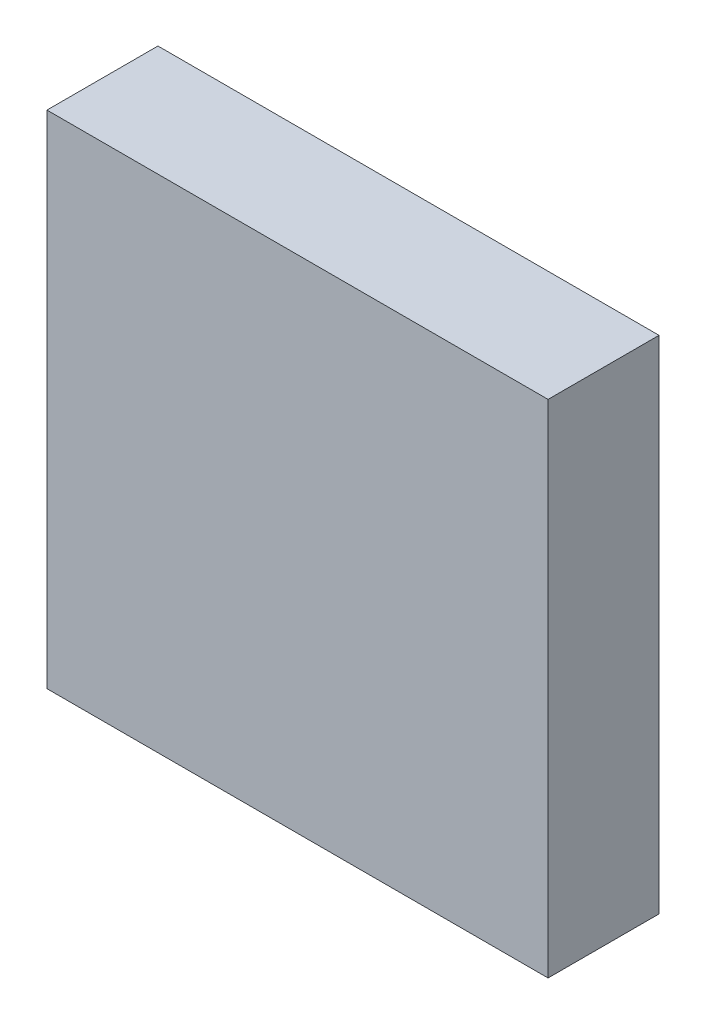
ISO-10303-21;
HEADER;
FILE_DESCRIPTION(('STEP AP214'),'2;1');
FILE_NAME('part.step','',(''),(''),'','','');
FILE_SCHEMA(('AUTOMOTIVE_DESIGN { 1 0 10303 214 1 1 1 1 }'));
ENDSEC;
DATA;
#1=APPLICATION_CONTEXT('core data for automotive mechanical design processes');
#2=APPLICATION_PROTOCOL_DEFINITION('international standard','automotive_design',2000,#1);
#3=PRODUCT_CONTEXT('',#1,'mechanical');
#4=PRODUCT('Part','Part','',(#3));
#5=PRODUCT_RELATED_PRODUCT_CATEGORY('part','',(#4));
#6=PRODUCT_DEFINITION_FORMATION('','',#4);
#7=PRODUCT_DEFINITION_CONTEXT('part definition',#1,'design');
#8=PRODUCT_DEFINITION('design','',#6,#7);
#9=PRODUCT_DEFINITION_SHAPE('','',#8);
#10=(LENGTH_UNIT() NAMED_UNIT(*) SI_UNIT(.MILLI.,.METRE.));
#11=(NAMED_UNIT(*) PLANE_ANGLE_UNIT() SI_UNIT($,.RADIAN.));
#12=(NAMED_UNIT(*) SI_UNIT($,.STERADIAN.) SOLID_ANGLE_UNIT());
#13=UNCERTAINTY_MEASURE_WITH_UNIT(LENGTH_MEASURE(1.E-05),#10,'distance_accuracy_value','');
#14=(GEOMETRIC_REPRESENTATION_CONTEXT(3) GLOBAL_UNCERTAINTY_ASSIGNED_CONTEXT((#13)) GLOBAL_UNIT_ASSIGNED_CONTEXT((#10,
#11,#12)) REPRESENTATION_CONTEXT('',''));
#15=CARTESIAN_POINT('',(0.,0.,0.));
#16=DIRECTION('',(0.,0.,1.));
#17=DIRECTION('',(1.,0.,0.));
#18=AXIS2_PLACEMENT_3D('',#15,#16,#17);
#19=CARTESIAN_POINT('',(0.,0.,0.90000074));
#20=DIRECTION('',(0.,0.,1.));
#21=DIRECTION('',(1.,0.,0.));
#22=AXIS2_PLACEMENT_3D('',#19,#20,#21);
#23=PLANE('',#22);
#24=DIRECTION('',(-1.,0.,0.));
#25=VECTOR('',#24,1.);
#26=CARTESIAN_POINT('',(2.032,2.032,0.90000074));
#27=LINE('',#26,#25);
#28=CARTESIAN_POINT('',(2.032,2.032,0.90000074));
#29=VERTEX_POINT('',#28);
#30=CARTESIAN_POINT('',(-2.032,2.032,0.90000074));
#31=VERTEX_POINT('',#30);
#32=EDGE_CURVE('E92',#29,#31,#27,.T.);
#33=ORIENTED_EDGE('',*,*,#32,.T.);
#34=DIRECTION('',(0.,-1.,0.));
#35=VECTOR('',#34,1.);
#36=CARTESIAN_POINT('',(-2.032,2.032,0.90000074));
#37=LINE('',#36,#35);
#38=CARTESIAN_POINT('',(-2.032,-2.032,0.90000074));
#39=VERTEX_POINT('',#38);
#40=EDGE_CURVE('E20',#31,#39,#37,.T.);
#41=ORIENTED_EDGE('',*,*,#40,.T.);
#42=DIRECTION('',(1.,0.,0.));
#43=VECTOR('',#42,1.);
#44=CARTESIAN_POINT('',(-2.032,-2.032,0.90000074));
#45=LINE('',#44,#43);
#46=CARTESIAN_POINT('',(2.032,-2.032,0.90000074));
#47=VERTEX_POINT('',#46);
#48=EDGE_CURVE('E85',#39,#47,#45,.T.);
#49=ORIENTED_EDGE('',*,*,#48,.T.);
#50=DIRECTION('',(0.,1.,0.));
#51=VECTOR('',#50,1.);
#52=CARTESIAN_POINT('',(2.032,-2.032,0.90000074));
#53=LINE('',#52,#51);
#54=EDGE_CURVE('E10',#47,#29,#53,.T.);
#55=ORIENTED_EDGE('',*,*,#54,.T.);
#56=EDGE_LOOP('',(#33,#41,#49,#55));
#57=FACE_BOUND('',#56,.T.);
#58=ADVANCED_FACE('F16',(#57),#23,.T.);
#59=CARTESIAN_POINT('',(0.,0.,0.));
#60=DIRECTION('',(0.,0.,1.));
#61=DIRECTION('',(1.,0.,0.));
#62=AXIS2_PLACEMENT_3D('',#59,#60,#61);
#63=PLANE('',#62);
#64=DIRECTION('',(0.,1.,0.));
#65=VECTOR('',#64,1.);
#66=CARTESIAN_POINT('',(2.032,-2.032,0.));
#67=LINE('',#66,#65);
#68=CARTESIAN_POINT('',(2.032,-2.032,0.));
#69=VERTEX_POINT('',#68);
#70=CARTESIAN_POINT('',(2.032,2.032,0.));
#71=VERTEX_POINT('',#70);
#72=EDGE_CURVE('E27',#69,#71,#67,.T.);
#73=ORIENTED_EDGE('',*,*,#72,.F.);
#74=DIRECTION('',(1.,0.,0.));
#75=VECTOR('',#74,1.);
#76=CARTESIAN_POINT('',(-2.032,-2.032,0.));
#77=LINE('',#76,#75);
#78=CARTESIAN_POINT('',(-2.032,-2.032,0.));
#79=VERTEX_POINT('',#78);
#80=EDGE_CURVE('E109',#79,#69,#77,.T.);
#81=ORIENTED_EDGE('',*,*,#80,.F.);
#82=DIRECTION('',(0.,-1.,0.));
#83=VECTOR('',#82,1.);
#84=CARTESIAN_POINT('',(-2.032,2.032,0.));
#85=LINE('',#84,#83);
#86=CARTESIAN_POINT('',(-2.032,2.032,0.));
#87=VERTEX_POINT('',#86);
#88=EDGE_CURVE('E74',#87,#79,#85,.T.);
#89=ORIENTED_EDGE('',*,*,#88,.F.);
#90=DIRECTION('',(-1.,0.,0.));
#91=VECTOR('',#90,1.);
#92=CARTESIAN_POINT('',(2.032,2.032,0.));
#93=LINE('',#92,#91);
#94=EDGE_CURVE('E91',#71,#87,#93,.T.);
#95=ORIENTED_EDGE('',*,*,#94,.F.);
#96=EDGE_LOOP('',(#73,#81,#89,#95));
#97=FACE_BOUND('',#96,.T.);
#98=ADVANCED_FACE('F95',(#97),#63,.F.);
#99=CARTESIAN_POINT('',(2.032,-2.032,0.));
#100=DIRECTION('',(-1.,0.,0.));
#101=DIRECTION('',(0.,0.,1.));
#102=AXIS2_PLACEMENT_3D('',#99,#100,#101);
#103=PLANE('',#102);
#104=ORIENTED_EDGE('',*,*,#72,.T.);
#105=DIRECTION('',(0.,0.,1.));
#106=VECTOR('',#105,1.);
#107=CARTESIAN_POINT('',(2.032,2.032,0.));
#108=LINE('',#107,#106);
#109=EDGE_CURVE('E79',#71,#29,#108,.T.);
#110=ORIENTED_EDGE('',*,*,#109,.T.);
#111=ORIENTED_EDGE('',*,*,#54,.F.);
#112=DIRECTION('',(0.,0.,1.));
#113=VECTOR('',#112,1.);
#114=CARTESIAN_POINT('',(2.032,-2.032,0.));
#115=LINE('',#114,#113);
#116=EDGE_CURVE('E82',#69,#47,#115,.T.);
#117=ORIENTED_EDGE('',*,*,#116,.F.);
#118=EDGE_LOOP('',(#104,#110,#111,#117));
#119=FACE_BOUND('',#118,.T.);
#120=ADVANCED_FACE('F78',(#119),#103,.F.);
#121=CARTESIAN_POINT('',(-2.032,-2.032,0.));
#122=DIRECTION('',(0.,1.,0.));
#123=DIRECTION('',(1.,0.,0.));
#124=AXIS2_PLACEMENT_3D('',#121,#122,#123);
#125=PLANE('',#124);
#126=ORIENTED_EDGE('',*,*,#80,.T.);
#127=ORIENTED_EDGE('',*,*,#116,.T.);
#128=ORIENTED_EDGE('',*,*,#48,.F.);
#129=DIRECTION('',(0.,0.,1.));
#130=VECTOR('',#129,1.);
#131=CARTESIAN_POINT('',(-2.032,-2.032,0.));
#132=LINE('',#131,#130);
#133=EDGE_CURVE('E108',#79,#39,#132,.T.);
#134=ORIENTED_EDGE('',*,*,#133,.F.);
#135=EDGE_LOOP('',(#126,#127,#128,#134));
#136=FACE_BOUND('',#135,.T.);
#137=ADVANCED_FACE('F18',(#136),#125,.F.);
#138=CARTESIAN_POINT('',(-2.032,2.032,0.));
#139=DIRECTION('',(1.,0.,0.));
#140=DIRECTION('',(0.,1.,0.));
#141=AXIS2_PLACEMENT_3D('',#138,#139,#140);
#142=PLANE('',#141);
#143=ORIENTED_EDGE('',*,*,#88,.T.);
#144=ORIENTED_EDGE('',*,*,#133,.T.);
#145=ORIENTED_EDGE('',*,*,#40,.F.);
#146=DIRECTION('',(0.,0.,1.));
#147=VECTOR('',#146,1.);
#148=CARTESIAN_POINT('',(-2.032,2.032,0.));
#149=LINE('',#148,#147);
#150=EDGE_CURVE('E97',#87,#31,#149,.T.);
#151=ORIENTED_EDGE('',*,*,#150,.F.);
#152=EDGE_LOOP('',(#143,#144,#145,#151));
#153=FACE_BOUND('',#152,.T.);
#154=ADVANCED_FACE('F123',(#153),#142,.F.);
#155=CARTESIAN_POINT('',(2.032,2.032,0.));
#156=DIRECTION('',(0.,-1.,0.));
#157=DIRECTION('',(0.,0.,-1.));
#158=AXIS2_PLACEMENT_3D('',#155,#156,#157);
#159=PLANE('',#158);
#160=ORIENTED_EDGE('',*,*,#94,.T.);
#161=ORIENTED_EDGE('',*,*,#150,.T.);
#162=ORIENTED_EDGE('',*,*,#32,.F.);
#163=ORIENTED_EDGE('',*,*,#109,.F.);
#164=EDGE_LOOP('',(#160,#161,#162,#163));
#165=FACE_BOUND('',#164,.T.);
#166=ADVANCED_FACE('F89',(#165),#159,.F.);
#167=CLOSED_SHELL('',(#58,#98,#120,#137,#154,#166));
#168=MANIFOLD_SOLID_BREP('B1',#167);
#169=ADVANCED_BREP_SHAPE_REPRESENTATION('',(#18,#168),#14);
#170=SHAPE_DEFINITION_REPRESENTATION(#9,#169);
ENDSEC;
END-ISO-10303-21;
